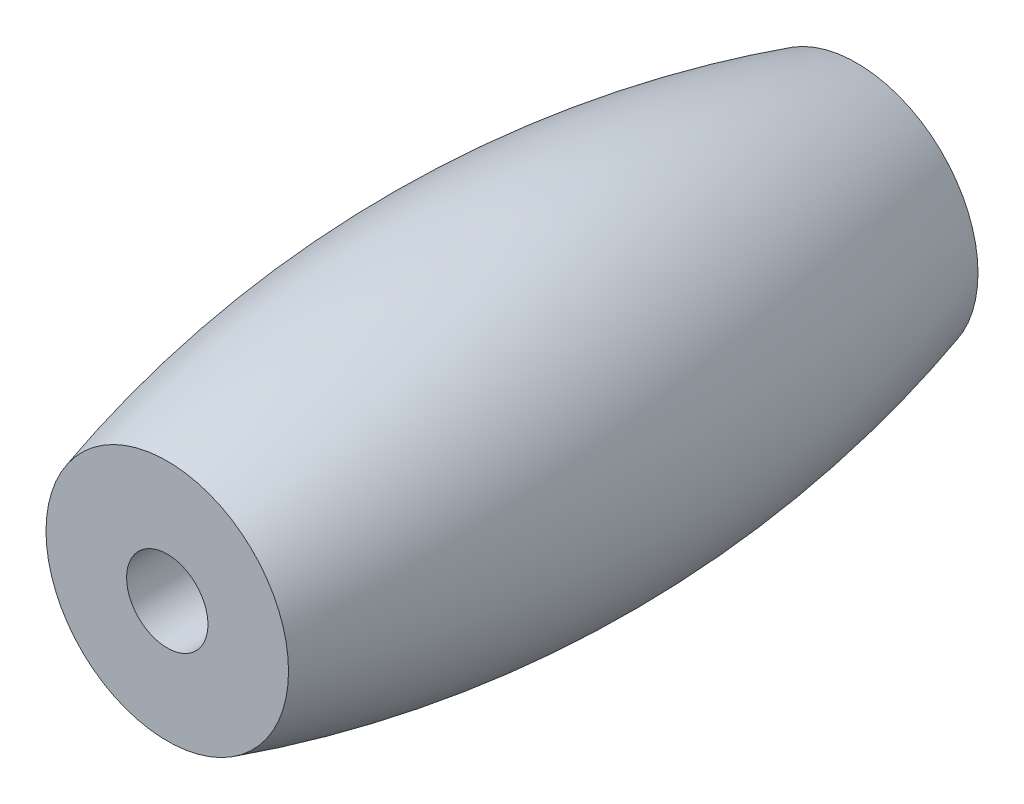
ISO-10303-21;
HEADER;
FILE_DESCRIPTION(('STEP AP214'),'2;1');
FILE_NAME('part.step','',(''),(''),'','','');
FILE_SCHEMA(('AUTOMOTIVE_DESIGN { 1 0 10303 214 1 1 1 1 }'));
ENDSEC;
DATA;
#1=APPLICATION_CONTEXT('core data for automotive mechanical design processes');
#2=APPLICATION_PROTOCOL_DEFINITION('international standard','automotive_design',2000,#1);
#3=PRODUCT_CONTEXT('',#1,'mechanical');
#4=PRODUCT('Part','Part','',(#3));
#5=PRODUCT_RELATED_PRODUCT_CATEGORY('part','',(#4));
#6=PRODUCT_DEFINITION_FORMATION('','',#4);
#7=PRODUCT_DEFINITION_CONTEXT('part definition',#1,'design');
#8=PRODUCT_DEFINITION('design','',#6,#7);
#9=PRODUCT_DEFINITION_SHAPE('','',#8);
#10=(LENGTH_UNIT() NAMED_UNIT(*) SI_UNIT(.MILLI.,.METRE.));
#11=(NAMED_UNIT(*) PLANE_ANGLE_UNIT() SI_UNIT($,.RADIAN.));
#12=(NAMED_UNIT(*) SI_UNIT($,.STERADIAN.) SOLID_ANGLE_UNIT());
#13=UNCERTAINTY_MEASURE_WITH_UNIT(LENGTH_MEASURE(1.E-05),#10,'distance_accuracy_value','');
#14=(GEOMETRIC_REPRESENTATION_CONTEXT(3) GLOBAL_UNCERTAINTY_ASSIGNED_CONTEXT((#13)) GLOBAL_UNIT_ASSIGNED_CONTEXT((#10,
#11,#12)) REPRESENTATION_CONTEXT('',''));
#15=CARTESIAN_POINT('',(0.,0.,0.));
#16=DIRECTION('',(0.,0.,1.));
#17=DIRECTION('',(1.,0.,0.));
#18=AXIS2_PLACEMENT_3D('',#15,#16,#17);
#19=CARTESIAN_POINT('',(0.,25.43,0.));
#20=DIRECTION('',(0.,0.,1.));
#21=DIRECTION('',(1.,0.,0.));
#22=AXIS2_PLACEMENT_3D('',#19,#20,#21);
#23=DEGENERATE_TOROIDAL_SURFACE('',#22,27.4299999999997,31.8299999999997,.F.);
#24=CARTESIAN_POINT('',(0.,25.43,8.90000000000001));
#25=DIRECTION('',(0.,0.,1.));
#26=DIRECTION('',(1.,0.,0.));
#27=AXIS2_PLACEMENT_3D('',#24,#25,#26);
#28=CIRCLE('',#27,3.13041393698717);
#29=CARTESIAN_POINT('',(3.13041393698717,25.43,8.90000000000001));
#30=VERTEX_POINT('',#29);
#31=EDGE_CURVE('E49',#30,#30,#28,.T.);
#32=ORIENTED_EDGE('',*,*,#31,.F.);
#33=EDGE_LOOP('',(#32));
#34=FACE_BOUND('',#33,.T.);
#35=CARTESIAN_POINT('',(0.,25.43,-8.9));
#36=DIRECTION('',(0.,0.,1.));
#37=DIRECTION('',(1.,0.,0.));
#38=AXIS2_PLACEMENT_3D('',#35,#36,#37);
#39=CIRCLE('',#38,3.13041393698716);
#40=CARTESIAN_POINT('',(3.13041393698716,25.43,-8.9));
#41=VERTEX_POINT('',#40);
#42=EDGE_CURVE('E12',#41,#41,#39,.T.);
#43=ORIENTED_EDGE('',*,*,#42,.T.);
#44=EDGE_LOOP('',(#43));
#45=FACE_BOUND('',#44,.T.);
#46=ADVANCED_FACE('F43',(#34,#45),#23,.F.);
#47=CARTESIAN_POINT('',(0.,25.43,-8.9));
#48=DIRECTION('',(0.,0.,1.));
#49=DIRECTION('',(1.,0.,0.));
#50=AXIS2_PLACEMENT_3D('',#47,#48,#49);
#51=PLANE('',#50);
#52=CARTESIAN_POINT('',(0.,25.43,-8.9));
#53=DIRECTION('',(0.,0.,-1.));
#54=DIRECTION('',(-1.,0.,0.));
#55=AXIS2_PLACEMENT_3D('',#52,#53,#54);
#56=CIRCLE('',#55,1.05);
#57=CARTESIAN_POINT('',(-1.05,25.43,-8.9));
#58=VERTEX_POINT('',#57);
#59=EDGE_CURVE('E57',#58,#58,#56,.T.);
#60=ORIENTED_EDGE('',*,*,#59,.F.);
#61=EDGE_LOOP('',(#60));
#62=FACE_BOUND('',#61,.T.);
#63=ORIENTED_EDGE('',*,*,#42,.F.);
#64=EDGE_LOOP('',(#63));
#65=FACE_BOUND('',#64,.T.);
#66=ADVANCED_FACE('F65',(#62,#65),#51,.F.);
#67=CARTESIAN_POINT('',(0.,25.43,8.90000000000001));
#68=DIRECTION('',(0.,0.,-1.));
#69=DIRECTION('',(-1.,0.,0.));
#70=AXIS2_PLACEMENT_3D('',#67,#68,#69);
#71=PLANE('',#70);
#72=CARTESIAN_POINT('',(0.,25.43,8.90000000000001));
#73=DIRECTION('',(0.,0.,-1.));
#74=DIRECTION('',(-1.,0.,0.));
#75=AXIS2_PLACEMENT_3D('',#72,#73,#74);
#76=CIRCLE('',#75,1.05);
#77=CARTESIAN_POINT('',(-1.05,25.43,8.90000000000001));
#78=VERTEX_POINT('',#77);
#79=EDGE_CURVE('E53',#78,#78,#76,.T.);
#80=ORIENTED_EDGE('',*,*,#79,.T.);
#81=EDGE_LOOP('',(#80));
#82=FACE_BOUND('',#81,.T.);
#83=ORIENTED_EDGE('',*,*,#31,.T.);
#84=EDGE_LOOP('',(#83));
#85=FACE_BOUND('',#84,.T.);
#86=ADVANCED_FACE('F68',(#82,#85),#71,.F.);
#87=CARTESIAN_POINT('',(0.,25.43,8.90000000000001));
#88=DIRECTION('',(0.,0.,-1.));
#89=DIRECTION('',(-1.,0.,0.));
#90=AXIS2_PLACEMENT_3D('',#87,#88,#89);
#91=CYLINDRICAL_SURFACE('',#90,1.05);
#92=ORIENTED_EDGE('',*,*,#79,.F.);
#93=EDGE_LOOP('',(#92));
#94=FACE_BOUND('',#93,.T.);
#95=ORIENTED_EDGE('',*,*,#59,.T.);
#96=EDGE_LOOP('',(#95));
#97=FACE_BOUND('',#96,.T.);
#98=ADVANCED_FACE('F63',(#94,#97),#91,.F.);
#99=CLOSED_SHELL('',(#46,#66,#86,#98));
#100=MANIFOLD_SOLID_BREP('B2',#99);
#101=ADVANCED_BREP_SHAPE_REPRESENTATION('',(#18,#100),#14);
#102=SHAPE_DEFINITION_REPRESENTATION(#9,#101);
ENDSEC;
END-ISO-10303-21;
